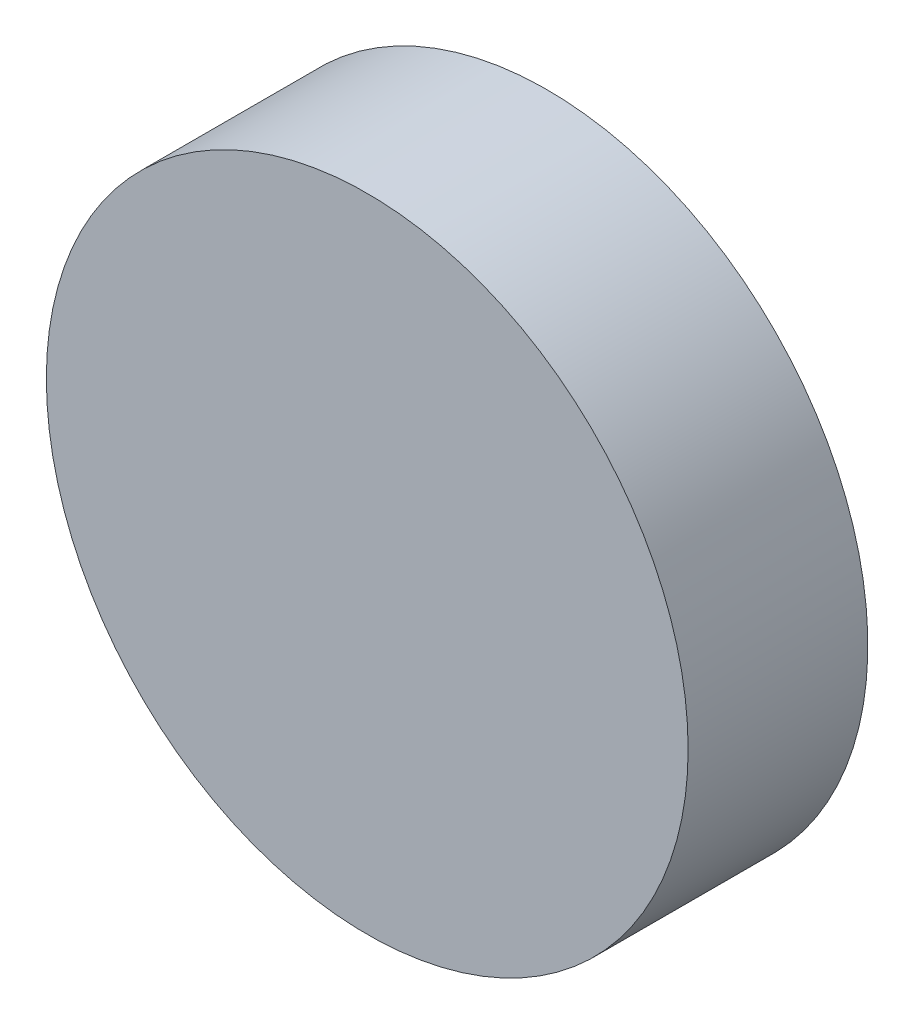
ISO-10303-21;
HEADER;
FILE_DESCRIPTION(('STEP AP214'),'2;1');
FILE_NAME('part.step','',(''),(''),'','','');
FILE_SCHEMA(('AUTOMOTIVE_DESIGN { 1 0 10303 214 1 1 1 1 }'));
ENDSEC;
DATA;
#1=APPLICATION_CONTEXT('core data for automotive mechanical design processes');
#2=APPLICATION_PROTOCOL_DEFINITION('international standard','automotive_design',2000,#1);
#3=PRODUCT_CONTEXT('',#1,'mechanical');
#4=PRODUCT('Part','Part','',(#3));
#5=PRODUCT_RELATED_PRODUCT_CATEGORY('part','',(#4));
#6=PRODUCT_DEFINITION_FORMATION('','',#4);
#7=PRODUCT_DEFINITION_CONTEXT('part definition',#1,'design');
#8=PRODUCT_DEFINITION('design','',#6,#7);
#9=PRODUCT_DEFINITION_SHAPE('','',#8);
#10=(LENGTH_UNIT() NAMED_UNIT(*) SI_UNIT(.MILLI.,.METRE.));
#11=(NAMED_UNIT(*) PLANE_ANGLE_UNIT() SI_UNIT($,.RADIAN.));
#12=(NAMED_UNIT(*) SI_UNIT($,.STERADIAN.) SOLID_ANGLE_UNIT());
#13=UNCERTAINTY_MEASURE_WITH_UNIT(LENGTH_MEASURE(1.E-05),#10,'distance_accuracy_value','');
#14=(GEOMETRIC_REPRESENTATION_CONTEXT(3) GLOBAL_UNCERTAINTY_ASSIGNED_CONTEXT((#13)) GLOBAL_UNIT_ASSIGNED_CONTEXT((#10,
#11,#12)) REPRESENTATION_CONTEXT('',''));
#15=CARTESIAN_POINT('',(0.,0.,0.));
#16=DIRECTION('',(0.,0.,1.));
#17=DIRECTION('',(1.,0.,0.));
#18=AXIS2_PLACEMENT_3D('',#15,#16,#17);
#19=CARTESIAN_POINT('',(0.,0.,22.5));
#20=DIRECTION('',(0.,0.,-1.));
#21=DIRECTION('',(-1.,0.,0.));
#22=AXIS2_PLACEMENT_3D('',#19,#20,#21);
#23=CYLINDRICAL_SURFACE('',#22,12.5);
#24=CARTESIAN_POINT('',(0.,0.,7.5));
#25=DIRECTION('',(0.,0.,1.));
#26=DIRECTION('',(1.,0.,0.));
#27=AXIS2_PLACEMENT_3D('',#24,#25,#26);
#28=CIRCLE('',#27,12.5);
#29=CARTESIAN_POINT('',(12.5,0.,7.5));
#30=VERTEX_POINT('',#29);
#31=EDGE_CURVE('E11',#30,#30,#28,.T.);
#32=ORIENTED_EDGE('',*,*,#31,.F.);
#33=EDGE_LOOP('',(#32));
#34=FACE_BOUND('',#33,.T.);
#35=CARTESIAN_POINT('',(0.,0.,0.5));
#36=DIRECTION('',(0.,0.,-1.));
#37=DIRECTION('',(-1.,0.,0.));
#38=AXIS2_PLACEMENT_3D('',#35,#36,#37);
#39=CIRCLE('',#38,12.5);
#40=CARTESIAN_POINT('',(-12.5,0.,0.5));
#41=VERTEX_POINT('',#40);
#42=EDGE_CURVE('E33',#41,#41,#39,.F.);
#43=ORIENTED_EDGE('',*,*,#42,.T.);
#44=EDGE_LOOP('',(#43));
#45=FACE_BOUND('',#44,.T.);
#46=ADVANCED_FACE('F29',(#34,#45),#23,.T.);
#47=CARTESIAN_POINT('',(-14.3704,-14.3704,7.5));
#48=DIRECTION('',(0.,0.,1.));
#49=DIRECTION('',(1.,0.,0.));
#50=AXIS2_PLACEMENT_3D('',#47,#48,#49);
#51=PLANE('',#50);
#52=ORIENTED_EDGE('',*,*,#31,.T.);
#53=EDGE_LOOP('',(#52));
#54=FACE_BOUND('',#53,.T.);
#55=ADVANCED_FACE('F31',(#54),#51,.T.);
#56=CARTESIAN_POINT('',(42.9329477753981,-27.7415448266964,0.5));
#57=DIRECTION('',(0.,0.,-1.));
#58=DIRECTION('',(-1.,0.,0.));
#59=AXIS2_PLACEMENT_3D('',#56,#57,#58);
#60=PLANE('',#59);
#61=ORIENTED_EDGE('',*,*,#42,.F.);
#62=EDGE_LOOP('',(#61));
#63=FACE_BOUND('',#62,.T.);
#64=ADVANCED_FACE('F43',(#63),#60,.T.);
#65=CLOSED_SHELL('',(#46,#55,#64));
#66=MANIFOLD_SOLID_BREP('B2',#65);
#67=ADVANCED_BREP_SHAPE_REPRESENTATION('',(#18,#66),#14);
#68=SHAPE_DEFINITION_REPRESENTATION(#9,#67);
ENDSEC;
END-ISO-10303-21;
